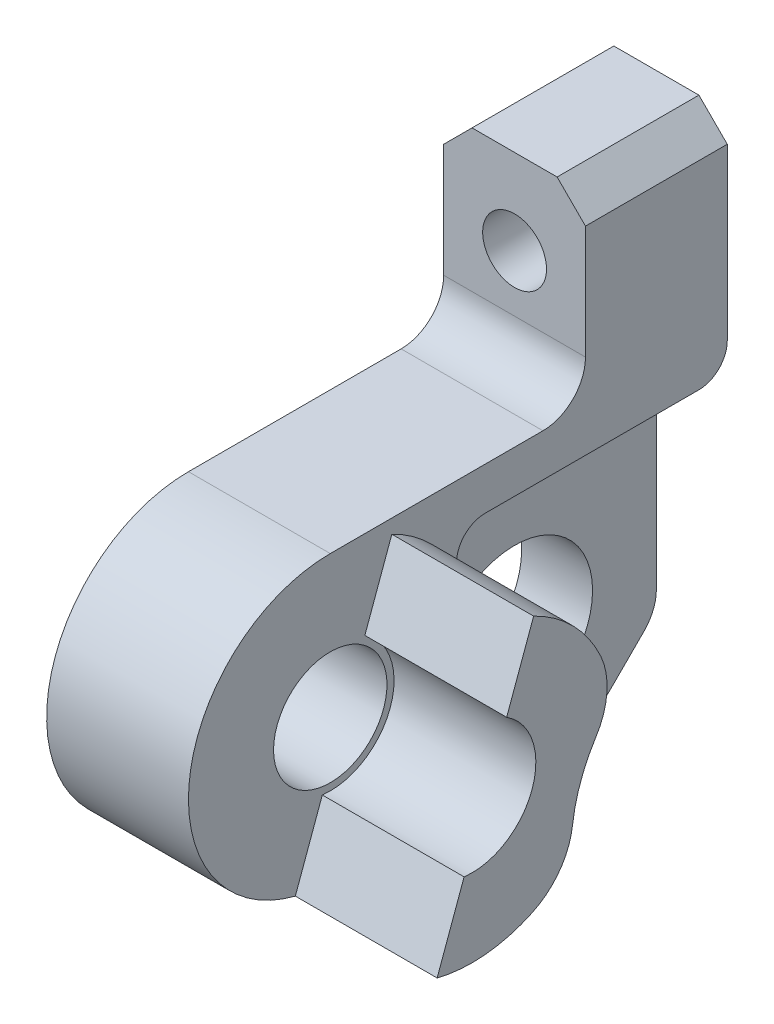
ISO-10303-21;
HEADER;
FILE_DESCRIPTION(('STEP AP214'),'2;1');
FILE_NAME('part.step','',(''),(''),'','','');
FILE_SCHEMA(('AUTOMOTIVE_DESIGN { 1 0 10303 214 1 1 1 1 }'));
ENDSEC;
DATA;
#1=APPLICATION_CONTEXT('core data for automotive mechanical design processes');
#2=APPLICATION_PROTOCOL_DEFINITION('international standard','automotive_design',2000,#1);
#3=PRODUCT_CONTEXT('',#1,'mechanical');
#4=PRODUCT('Part','Part','',(#3));
#5=PRODUCT_RELATED_PRODUCT_CATEGORY('part','',(#4));
#6=PRODUCT_DEFINITION_FORMATION('','',#4);
#7=PRODUCT_DEFINITION_CONTEXT('part definition',#1,'design');
#8=PRODUCT_DEFINITION('design','',#6,#7);
#9=PRODUCT_DEFINITION_SHAPE('','',#8);
#10=(LENGTH_UNIT() NAMED_UNIT(*) SI_UNIT(.MILLI.,.METRE.));
#11=(NAMED_UNIT(*) PLANE_ANGLE_UNIT() SI_UNIT($,.RADIAN.));
#12=(NAMED_UNIT(*) SI_UNIT($,.STERADIAN.) SOLID_ANGLE_UNIT());
#13=UNCERTAINTY_MEASURE_WITH_UNIT(LENGTH_MEASURE(1.E-05),#10,'distance_accuracy_value','');
#14=(GEOMETRIC_REPRESENTATION_CONTEXT(3) GLOBAL_UNCERTAINTY_ASSIGNED_CONTEXT((#13)) GLOBAL_UNIT_ASSIGNED_CONTEXT((#10,
#11,#12)) REPRESENTATION_CONTEXT('',''));
#15=CARTESIAN_POINT('',(0.,0.,0.));
#16=DIRECTION('',(0.,0.,1.));
#17=DIRECTION('',(1.,0.,0.));
#18=AXIS2_PLACEMENT_3D('',#15,#16,#17);
#19=CARTESIAN_POINT('',(7.5,0.,0.));
#20=DIRECTION('',(-1.,0.,0.));
#21=DIRECTION('',(0.,0.,1.));
#22=AXIS2_PLACEMENT_3D('',#19,#20,#21);
#23=PLANE('',#22);
#24=CARTESIAN_POINT('',(7.5,0.,0.));
#25=DIRECTION('',(-1.,0.,0.));
#26=DIRECTION('',(0.,0.,1.));
#27=AXIS2_PLACEMENT_3D('',#24,#25,#26);
#28=CIRCLE('',#27,4.);
#29=CARTESIAN_POINT('',(7.5,0.,4.));
#30=VERTEX_POINT('',#29);
#31=EDGE_CURVE('E348',#30,#30,#28,.T.);
#32=ORIENTED_EDGE('',*,*,#31,.T.);
#33=EDGE_LOOP('',(#32));
#34=FACE_BOUND('',#33,.T.);
#35=CARTESIAN_POINT('',(7.5,0.,0.));
#36=DIRECTION('',(1.,0.,0.));
#37=DIRECTION('',(0.,0.,-1.));
#38=AXIS2_PLACEMENT_3D('',#35,#36,#37);
#39=CIRCLE('',#38,10.);
#40=CARTESIAN_POINT('',(7.5,4.17319289451121,-9.0875993015318));
#41=VERTEX_POINT('',#40);
#42=CARTESIAN_POINT('',(7.5,9.00780338091209,-4.34275007925034));
#43=VERTEX_POINT('',#42);
#44=EDGE_CURVE('E255',#41,#43,#39,.T.);
#45=ORIENTED_EDGE('',*,*,#44,.F.);
#46=CARTESIAN_POINT('',(7.5,2.12739887121385,-4.52528335299855));
#47=DIRECTION('',(-1.,0.,0.));
#48=DIRECTION('',(0.,0.,1.));
#49=AXIS2_PLACEMENT_3D('',#46,#47,#48);
#50=CIRCLE('',#49,5.);
#51=CARTESIAN_POINT('',(7.5,4.17925682034681,-9.08487532559652));
#52=VERTEX_POINT('',#51);
#53=EDGE_CURVE('E278',#41,#52,#50,.F.);
#54=ORIENTED_EDGE('',*,*,#53,.T.);
#55=CARTESIAN_POINT('',(7.5,5.,-10.9087121146357));
#56=DIRECTION('',(1.,0.,0.));
#57=DIRECTION('',(0.,0.,-1.));
#58=AXIS2_PLACEMENT_3D('',#55,#56,#57);
#59=CIRCLE('',#58,2.);
#60=CARTESIAN_POINT('',(7.5,7.,-10.9087121146357));
#61=VERTEX_POINT('',#60);
#62=EDGE_CURVE('E380',#61,#52,#59,.T.);
#63=ORIENTED_EDGE('',*,*,#62,.F.);
#64=DIRECTION('',(0.,0.,1.));
#65=VECTOR('',#64,1.);
#66=CARTESIAN_POINT('',(7.5,7.,-26.));
#67=LINE('',#66,#65);
#68=CARTESIAN_POINT('',(7.5,7.,-26.));
#69=VERTEX_POINT('',#68);
#70=EDGE_CURVE('E552',#69,#61,#67,.T.);
#71=ORIENTED_EDGE('',*,*,#70,.F.);
#72=CARTESIAN_POINT('',(7.5,9.,-26.));
#73=DIRECTION('',(-1.,0.,0.));
#74=DIRECTION('',(0.,0.,1.));
#75=AXIS2_PLACEMENT_3D('',#72,#73,#74);
#76=CIRCLE('',#75,2.);
#77=CARTESIAN_POINT('',(7.5,9.,-28.));
#78=VERTEX_POINT('',#77);
#79=EDGE_CURVE('E549',#78,#69,#76,.T.);
#80=ORIENTED_EDGE('',*,*,#79,.F.);
#81=DIRECTION('',(0.,-1.,0.));
#82=VECTOR('',#81,1.);
#83=CARTESIAN_POINT('',(7.5,23.,-28.));
#84=LINE('',#83,#82);
#85=CARTESIAN_POINT('',(7.5,21.,-28.));
#86=VERTEX_POINT('',#85);
#87=EDGE_CURVE('E545',#86,#78,#84,.T.);
#88=ORIENTED_EDGE('',*,*,#87,.F.);
#89=DIRECTION('',(0.,0.,1.));
#90=VECTOR('',#89,1.);
#91=CARTESIAN_POINT('',(7.5,21.,0.));
#92=LINE('',#91,#90);
#93=CARTESIAN_POINT('',(7.5,21.,-18.));
#94=VERTEX_POINT('',#93);
#95=EDGE_CURVE('E418',#86,#94,#92,.T.);
#96=ORIENTED_EDGE('',*,*,#95,.T.);
#97=DIRECTION('',(0.,1.,0.));
#98=VECTOR('',#97,1.);
#99=CARTESIAN_POINT('',(7.5,13.,-18.));
#100=LINE('',#99,#98);
#101=CARTESIAN_POINT('',(7.5,13.,-18.));
#102=VERTEX_POINT('',#101);
#103=EDGE_CURVE('E544',#102,#94,#100,.T.);
#104=ORIENTED_EDGE('',*,*,#103,.F.);
#105=CARTESIAN_POINT('',(7.5,13.,-15.));
#106=DIRECTION('',(1.,0.,0.));
#107=DIRECTION('',(0.,0.,-1.));
#108=AXIS2_PLACEMENT_3D('',#105,#106,#107);
#109=CIRCLE('',#108,3.);
#110=CARTESIAN_POINT('',(7.5,10.,-15.));
#111=VERTEX_POINT('',#110);
#112=EDGE_CURVE('E541',#111,#102,#109,.T.);
#113=ORIENTED_EDGE('',*,*,#112,.F.);
#114=DIRECTION('',(0.,0.,-1.));
#115=VECTOR('',#114,1.);
#116=CARTESIAN_POINT('',(7.5,10.,0.));
#117=LINE('',#116,#115);
#118=CARTESIAN_POINT('',(7.5,10.,0.));
#119=VERTEX_POINT('',#118);
#120=EDGE_CURVE('E354',#119,#111,#117,.T.);
#121=ORIENTED_EDGE('',*,*,#120,.F.);
#122=CARTESIAN_POINT('',(7.5,0.,0.));
#123=DIRECTION('',(-1.,0.,0.));
#124=DIRECTION('',(0.,0.,1.));
#125=AXIS2_PLACEMENT_3D('',#122,#123,#124);
#126=CIRCLE('',#125,10.);
#127=CARTESIAN_POINT('',(7.5,-9.69184366756342,2.46336483767852));
#128=VERTEX_POINT('',#127);
#129=EDGE_CURVE('E356',#128,#119,#126,.T.);
#130=ORIENTED_EDGE('',*,*,#129,.F.);
#131=DIRECTION('',(0.,-0.93969262078591,0.342020143325666));
#132=VECTOR('',#131,1.);
#133=CARTESIAN_POINT('',(7.5,-0.342020143325666,-0.93969262078591));
#134=LINE('',#133,#132);
#135=CARTESIAN_POINT('',(7.5,-4.46490478457143,0.560914667940823));
#136=VERTEX_POINT('',#135);
#137=EDGE_CURVE('E272',#136,#128,#134,.T.);
#138=ORIENTED_EDGE('',*,*,#137,.F.);
#139=CARTESIAN_POINT('',(7.5,0.,0.));
#140=DIRECTION('',(1.,0.,0.));
#141=DIRECTION('',(0.,0.,-1.));
#142=AXIS2_PLACEMENT_3D('',#139,#140,#141);
#143=CIRCLE('',#142,4.5);
#144=CARTESIAN_POINT('',(7.5,3.7808644979201,-2.44029990951264));
#145=VERTEX_POINT('',#144);
#146=EDGE_CURVE('E56',#136,#145,#143,.T.);
#147=ORIENTED_EDGE('',*,*,#146,.T.);
#148=DIRECTION('',(0.,-0.93969262078591,0.342020143325665));
#149=VECTOR('',#148,1.);
#150=CARTESIAN_POINT('',(7.5,-0.342020143325665,-0.93969262078591));
#151=LINE('',#150,#149);
#152=EDGE_CURVE('E51',#43,#145,#151,.T.);
#153=ORIENTED_EDGE('',*,*,#152,.F.);
#154=EDGE_LOOP('',(#45,#54,#63,#71,#80,#88,#96,#104,#113,#121,#130,#138,#147,#153));
#155=FACE_BOUND('',#154,.T.);
#156=ADVANCED_FACE('F34',(#34,#155),#23,.F.);
#157=CARTESIAN_POINT('',(2.5,17.,-28.00005));
#158=DIRECTION('',(0.,0.,1.));
#159=DIRECTION('',(1.,0.,0.));
#160=AXIS2_PLACEMENT_3D('',#157,#158,#159);
#161=CYLINDRICAL_SURFACE('',#160,2.25);
#162=CARTESIAN_POINT('',(2.5,17.,-18.));
#163=DIRECTION('',(0.,0.,1.));
#164=DIRECTION('',(1.,0.,0.));
#165=AXIS2_PLACEMENT_3D('',#162,#163,#164);
#166=CIRCLE('',#165,2.25);
#167=CARTESIAN_POINT('',(4.75,17.,-18.));
#168=VERTEX_POINT('',#167);
#169=EDGE_CURVE('E345',#168,#168,#166,.T.);
#170=ORIENTED_EDGE('',*,*,#169,.T.);
#171=EDGE_LOOP('',(#170));
#172=FACE_BOUND('',#171,.T.);
#173=CARTESIAN_POINT('',(2.5,17.,-22.));
#174=DIRECTION('',(0.,0.,-1.));
#175=DIRECTION('',(-1.,0.,0.));
#176=AXIS2_PLACEMENT_3D('',#173,#174,#175);
#177=CIRCLE('',#176,2.25);
#178=CARTESIAN_POINT('',(0.250000000000001,17.,-22.));
#179=VERTEX_POINT('',#178);
#180=EDGE_CURVE('E334',#179,#179,#177,.F.);
#181=ORIENTED_EDGE('',*,*,#180,.F.);
#182=EDGE_LOOP('',(#181));
#183=FACE_BOUND('',#182,.T.);
#184=ADVANCED_FACE('F581',(#172,#183),#161,.F.);
#185=CARTESIAN_POINT('',(2.5,0.,0.));
#186=DIRECTION('',(1.,0.,0.));
#187=DIRECTION('',(0.,0.,-1.));
#188=AXIS2_PLACEMENT_3D('',#185,#186,#187);
#189=PLANE('',#188);
#190=CARTESIAN_POINT('',(2.5,-6.5,-18.));
#191=DIRECTION('',(1.,0.,0.));
#192=DIRECTION('',(0.,0.,-1.));
#193=AXIS2_PLACEMENT_3D('',#190,#191,#192);
#194=CIRCLE('',#193,5.5);
#195=CARTESIAN_POINT('',(2.5,-6.5,-23.5));
#196=VERTEX_POINT('',#195);
#197=EDGE_CURVE('E442',#196,#196,#194,.T.);
#198=ORIENTED_EDGE('',*,*,#197,.F.);
#199=EDGE_LOOP('',(#198));
#200=FACE_BOUND('',#199,.T.);
#201=CARTESIAN_POINT('',(2.5,5.,-10.9087121146357));
#202=DIRECTION('',(1.,0.,0.));
#203=DIRECTION('',(0.,0.,-1.));
#204=AXIS2_PLACEMENT_3D('',#201,#202,#203);
#205=CIRCLE('',#204,2.);
#206=CARTESIAN_POINT('',(2.5,7.,-10.9087121146357));
#207=VERTEX_POINT('',#206);
#208=CARTESIAN_POINT('',(2.5,4.17925682034681,-9.08487532559652));
#209=VERTEX_POINT('',#208);
#210=EDGE_CURVE('E433',#207,#209,#205,.T.);
#211=ORIENTED_EDGE('',*,*,#210,.T.);
#212=CARTESIAN_POINT('',(2.5,2.12739887121385,-4.52528335299855));
#213=DIRECTION('',(1.,0.,0.));
#214=DIRECTION('',(0.,0.,-1.));
#215=AXIS2_PLACEMENT_3D('',#212,#213,#214);
#216=CIRCLE('',#215,5.);
#217=CARTESIAN_POINT('',(2.5,-0.568663276040478,-8.7361323051865));
#218=VERTEX_POINT('',#217);
#219=EDGE_CURVE('E11',#209,#218,#216,.F.);
#220=ORIENTED_EDGE('',*,*,#219,.T.);
#221=CARTESIAN_POINT('',(2.5,-6.5,-18.));
#222=DIRECTION('',(1.,0.,0.));
#223=DIRECTION('',(0.,0.,1.));
#224=AXIS2_PLACEMENT_3D('',#221,#222,#223);
#225=CIRCLE('',#224,11.);
#226=CARTESIAN_POINT('',(2.5,-5.14379664903589,-7.08392412673704));
#227=VERTEX_POINT('',#226);
#228=EDGE_CURVE('E357',#218,#227,#225,.T.);
#229=ORIENTED_EDGE('',*,*,#228,.T.);
#230=CARTESIAN_POINT('',(2.5,-4.52734058041584,-2.12207145707206));
#231=DIRECTION('',(1.,0.,0.));
#232=DIRECTION('',(0.,0.,-1.));
#233=AXIS2_PLACEMENT_3D('',#230,#231,#232);
#234=CIRCLE('',#233,5.);
#235=CARTESIAN_POINT('',(2.5,-9.05468116083169,-4.24414291414412));
#236=VERTEX_POINT('',#235);
#237=EDGE_CURVE('E43',#227,#236,#234,.F.);
#238=ORIENTED_EDGE('',*,*,#237,.T.);
#239=CARTESIAN_POINT('',(2.5,0.,0.));
#240=DIRECTION('',(-1.,0.,0.));
#241=DIRECTION('',(0.,0.,1.));
#242=AXIS2_PLACEMENT_3D('',#239,#240,#241);
#243=CIRCLE('',#242,10.);
#244=CARTESIAN_POINT('',(2.5,-9.4910655687307,3.14955145537498));
#245=VERTEX_POINT('',#244);
#246=EDGE_CURVE('E351',#236,#245,#243,.T.);
#247=ORIENTED_EDGE('',*,*,#246,.T.);
#248=DIRECTION('',(0.,-0.314955145537498,-0.94910655687307));
#249=VECTOR('',#248,1.);
#250=CARTESIAN_POINT('',(2.5,-9.49106556873069,3.14955145537497));
#251=LINE('',#250,#249);
#252=CARTESIAN_POINT('',(2.5,-15.5165122902942,-15.0079261173938));
#253=VERTEX_POINT('',#252);
#254=EDGE_CURVE('E388',#245,#253,#251,.T.);
#255=ORIENTED_EDGE('',*,*,#254,.T.);
#256=CARTESIAN_POINT('',(2.5,-6.5,-18.));
#257=DIRECTION('',(1.,0.,0.));
#258=DIRECTION('',(0.,0.,-1.));
#259=AXIS2_PLACEMENT_3D('',#256,#257,#258);
#260=CIRCLE('',#259,9.5);
#261=CARTESIAN_POINT('',(2.5,-13.2175144212722,-24.7175144212722));
#262=VERTEX_POINT('',#261);
#263=EDGE_CURVE('E390',#253,#262,#260,.T.);
#264=ORIENTED_EDGE('',*,*,#263,.T.);
#265=DIRECTION('',(0.,0.707106781186545,-0.70710678118655));
#266=VECTOR('',#265,1.);
#267=CARTESIAN_POINT('',(2.5,-10.8137084989848,-27.1213203435596));
#268=LINE('',#267,#266);
#269=CARTESIAN_POINT('',(2.5,-10.8137084989848,-27.1213203435596));
#270=VERTEX_POINT('',#269);
#271=EDGE_CURVE('E452',#262,#270,#268,.T.);
#272=ORIENTED_EDGE('',*,*,#271,.T.);
#273=CARTESIAN_POINT('',(2.5,-8.69238815542512,-25.));
#274=DIRECTION('',(1.,0.,0.));
#275=DIRECTION('',(0.,0.,1.));
#276=AXIS2_PLACEMENT_3D('',#273,#274,#275);
#277=CIRCLE('',#276,3.);
#278=CARTESIAN_POINT('',(2.5,-8.69238815542512,-28.));
#279=VERTEX_POINT('',#278);
#280=EDGE_CURVE('E454',#270,#279,#277,.T.);
#281=ORIENTED_EDGE('',*,*,#280,.T.);
#282=DIRECTION('',(0.,1.,0.));
#283=VECTOR('',#282,1.);
#284=CARTESIAN_POINT('',(2.5,23.,-28.));
#285=LINE('',#284,#283);
#286=CARTESIAN_POINT('',(2.5,9.,-28.));
#287=VERTEX_POINT('',#286);
#288=EDGE_CURVE('E374',#279,#287,#285,.T.);
#289=ORIENTED_EDGE('',*,*,#288,.T.);
#290=CARTESIAN_POINT('',(2.5,9.,-26.));
#291=DIRECTION('',(-1.,0.,0.));
#292=DIRECTION('',(0.,0.,1.));
#293=AXIS2_PLACEMENT_3D('',#290,#291,#292);
#294=CIRCLE('',#293,2.);
#295=CARTESIAN_POINT('',(2.5,7.,-26.));
#296=VERTEX_POINT('',#295);
#297=EDGE_CURVE('E369',#287,#296,#294,.T.);
#298=ORIENTED_EDGE('',*,*,#297,.T.);
#299=DIRECTION('',(0.,0.,1.));
#300=VECTOR('',#299,1.);
#301=CARTESIAN_POINT('',(2.5,7.,-26.));
#302=LINE('',#301,#300);
#303=EDGE_CURVE('E385',#296,#207,#302,.T.);
#304=ORIENTED_EDGE('',*,*,#303,.T.);
#305=EDGE_LOOP('',(#211,#220,#229,#238,#247,#255,#264,#272,#281,#289,#298,#304));
#306=FACE_BOUND('',#305,.T.);
#307=ADVANCED_FACE('F431',(#200,#306),#189,.T.);
#308=CARTESIAN_POINT('',(-2.5,0.,0.));
#309=DIRECTION('',(1.,0.,0.));
#310=DIRECTION('',(0.,0.,-1.));
#311=AXIS2_PLACEMENT_3D('',#308,#309,#310);
#312=PLANE('',#311);
#313=CARTESIAN_POINT('',(-2.5,0.,0.));
#314=DIRECTION('',(1.,0.,0.));
#315=DIRECTION('',(0.,0.,-1.));
#316=AXIS2_PLACEMENT_3D('',#313,#314,#315);
#317=CIRCLE('',#316,4.);
#318=CARTESIAN_POINT('',(-2.5,0.,-4.));
#319=VERTEX_POINT('',#318);
#320=EDGE_CURVE('E445',#319,#319,#317,.T.);
#321=ORIENTED_EDGE('',*,*,#320,.T.);
#322=EDGE_LOOP('',(#321));
#323=FACE_BOUND('',#322,.T.);
#324=DIRECTION('',(0.,-1.,0.));
#325=VECTOR('',#324,1.);
#326=CARTESIAN_POINT('',(-2.5,23.,-18.));
#327=LINE('',#326,#325);
#328=CARTESIAN_POINT('',(-2.5,21.,-18.));
#329=VERTEX_POINT('',#328);
#330=CARTESIAN_POINT('',(-2.5,13.,-18.));
#331=VERTEX_POINT('',#330);
#332=EDGE_CURVE('E470',#329,#331,#327,.T.);
#333=ORIENTED_EDGE('',*,*,#332,.F.);
#334=DIRECTION('',(0.,0.,-1.));
#335=VECTOR('',#334,1.);
#336=CARTESIAN_POINT('',(-2.5,21.,0.));
#337=LINE('',#336,#335);
#338=CARTESIAN_POINT('',(-2.5,21.,-28.));
#339=VERTEX_POINT('',#338);
#340=EDGE_CURVE('E412',#329,#339,#337,.T.);
#341=ORIENTED_EDGE('',*,*,#340,.T.);
#342=DIRECTION('',(0.,1.,0.));
#343=VECTOR('',#342,1.);
#344=CARTESIAN_POINT('',(-2.5,23.,-28.));
#345=LINE('',#344,#343);
#346=CARTESIAN_POINT('',(-2.5,-8.69238815542512,-28.));
#347=VERTEX_POINT('',#346);
#348=EDGE_CURVE('E467',#347,#339,#345,.T.);
#349=ORIENTED_EDGE('',*,*,#348,.F.);
#350=CARTESIAN_POINT('',(-2.5,-8.69238815542512,-25.));
#351=DIRECTION('',(1.,0.,0.));
#352=DIRECTION('',(0.,0.,1.));
#353=AXIS2_PLACEMENT_3D('',#350,#351,#352);
#354=CIRCLE('',#353,3.);
#355=CARTESIAN_POINT('',(-2.5,-10.8137084989848,-27.1213203435596));
#356=VERTEX_POINT('',#355);
#357=EDGE_CURVE('E465',#356,#347,#354,.T.);
#358=ORIENTED_EDGE('',*,*,#357,.F.);
#359=DIRECTION('',(0.,0.707106781186545,-0.70710678118655));
#360=VECTOR('',#359,1.);
#361=CARTESIAN_POINT('',(-2.5,-10.8137084989848,-27.1213203435596));
#362=LINE('',#361,#360);
#363=CARTESIAN_POINT('',(-2.5,-13.2175144212722,-24.7175144212722));
#364=VERTEX_POINT('',#363);
#365=EDGE_CURVE('E463',#364,#356,#362,.T.);
#366=ORIENTED_EDGE('',*,*,#365,.F.);
#367=CARTESIAN_POINT('',(-2.5,-6.5,-18.));
#368=DIRECTION('',(1.,0.,0.));
#369=DIRECTION('',(0.,0.,-1.));
#370=AXIS2_PLACEMENT_3D('',#367,#368,#369);
#371=CIRCLE('',#370,9.5);
#372=CARTESIAN_POINT('',(-2.5,-15.5165122902942,-15.0079261173938));
#373=VERTEX_POINT('',#372);
#374=EDGE_CURVE('E461',#373,#364,#371,.T.);
#375=ORIENTED_EDGE('',*,*,#374,.F.);
#376=DIRECTION('',(0.,-0.314955145537498,-0.94910655687307));
#377=VECTOR('',#376,1.);
#378=CARTESIAN_POINT('',(-2.5,-9.49106556873069,3.14955145537497));
#379=LINE('',#378,#377);
#380=CARTESIAN_POINT('',(-2.5,-9.49106556873069,3.14955145537497));
#381=VERTEX_POINT('',#380);
#382=EDGE_CURVE('E459',#381,#373,#379,.T.);
#383=ORIENTED_EDGE('',*,*,#382,.F.);
#384=CARTESIAN_POINT('',(-2.5,0.,0.));
#385=DIRECTION('',(1.,0.,0.));
#386=DIRECTION('',(0.,0.,-1.));
#387=AXIS2_PLACEMENT_3D('',#384,#385,#386);
#388=CIRCLE('',#387,10.);
#389=CARTESIAN_POINT('',(-2.5,10.,0.));
#390=VERTEX_POINT('',#389);
#391=EDGE_CURVE('E450',#390,#381,#388,.T.);
#392=ORIENTED_EDGE('',*,*,#391,.F.);
#393=DIRECTION('',(0.,0.,1.));
#394=VECTOR('',#393,1.);
#395=CARTESIAN_POINT('',(-2.5,10.,0.));
#396=LINE('',#395,#394);
#397=CARTESIAN_POINT('',(-2.5,10.,-15.));
#398=VERTEX_POINT('',#397);
#399=EDGE_CURVE('E391',#398,#390,#396,.T.);
#400=ORIENTED_EDGE('',*,*,#399,.F.);
#401=CARTESIAN_POINT('',(-2.5,13.,-15.));
#402=DIRECTION('',(-1.,0.,0.));
#403=DIRECTION('',(0.,0.,-1.));
#404=AXIS2_PLACEMENT_3D('',#401,#402,#403);
#405=CIRCLE('',#404,3.);
#406=EDGE_CURVE('E472',#331,#398,#405,.T.);
#407=ORIENTED_EDGE('',*,*,#406,.F.);
#408=EDGE_LOOP('',(#333,#341,#349,#358,#366,#375,#383,#392,#400,#407));
#409=FACE_BOUND('',#408,.T.);
#410=CARTESIAN_POINT('',(-2.5,-6.5,-18.));
#411=DIRECTION('',(1.,0.,0.));
#412=DIRECTION('',(0.,0.,-1.));
#413=AXIS2_PLACEMENT_3D('',#410,#411,#412);
#414=CIRCLE('',#413,5.5);
#415=CARTESIAN_POINT('',(-2.5,-6.5,-23.5));
#416=VERTEX_POINT('',#415);
#417=EDGE_CURVE('E440',#416,#416,#414,.T.);
#418=ORIENTED_EDGE('',*,*,#417,.T.);
#419=EDGE_LOOP('',(#418));
#420=FACE_BOUND('',#419,.T.);
#421=ADVANCED_FACE('F510',(#323,#409,#420),#312,.F.);
#422=CARTESIAN_POINT('',(2.5,0.,0.));
#423=DIRECTION('',(-1.,0.,0.));
#424=DIRECTION('',(0.,0.,1.));
#425=AXIS2_PLACEMENT_3D('',#422,#423,#424);
#426=CYLINDRICAL_SURFACE('',#425,10.);
#427=ORIENTED_EDGE('',*,*,#246,.F.);
#428=DIRECTION('',(-1.,0.,0.));
#429=VECTOR('',#428,1.);
#430=CARTESIAN_POINT('',(2.5,-9.05468116083169,-4.24414291414412));
#431=LINE('',#430,#429);
#432=CARTESIAN_POINT('',(17.5,-9.05468116083168,-4.24414291414412));
#433=VERTEX_POINT('',#432);
#434=EDGE_CURVE('E364',#236,#433,#431,.F.);
#435=ORIENTED_EDGE('',*,*,#434,.T.);
#436=CARTESIAN_POINT('',(17.5,0.,0.));
#437=DIRECTION('',(1.,0.,0.));
#438=DIRECTION('',(0.,0.,-1.));
#439=AXIS2_PLACEMENT_3D('',#436,#437,#438);
#440=CIRCLE('',#439,10.);
#441=CARTESIAN_POINT('',(17.5,-9.69184366756342,2.46336483767852));
#442=VERTEX_POINT('',#441);
#443=EDGE_CURVE('E248',#442,#433,#440,.T.);
#444=ORIENTED_EDGE('',*,*,#443,.F.);
#445=DIRECTION('',(-1.,0.,0.));
#446=VECTOR('',#445,1.);
#447=CARTESIAN_POINT('',(17.5,-9.69184366756342,2.46336483767852));
#448=LINE('',#447,#446);
#449=EDGE_CURVE('E239',#442,#128,#448,.T.);
#450=ORIENTED_EDGE('',*,*,#449,.T.);
#451=ORIENTED_EDGE('',*,*,#129,.T.);
#452=DIRECTION('',(-1.,0.,0.));
#453=VECTOR('',#452,1.);
#454=CARTESIAN_POINT('',(2.5,10.,0.));
#455=LINE('',#454,#453);
#456=EDGE_CURVE('E475',#119,#390,#455,.T.);
#457=ORIENTED_EDGE('',*,*,#456,.T.);
#458=ORIENTED_EDGE('',*,*,#391,.T.);
#459=DIRECTION('',(-1.,0.,0.));
#460=VECTOR('',#459,1.);
#461=CARTESIAN_POINT('',(2.5,-9.49106556873069,3.14955145537497));
#462=LINE('',#461,#460);
#463=EDGE_CURVE('E394',#245,#381,#462,.T.);
#464=ORIENTED_EDGE('',*,*,#463,.F.);
#465=EDGE_LOOP('',(#427,#435,#444,#450,#451,#457,#458,#464));
#466=FACE_BOUND('',#465,.T.);
#467=ADVANCED_FACE('F528',(#466),#426,.T.);
#468=CARTESIAN_POINT('',(2.5,-9.49106556873069,3.14955145537497));
#469=DIRECTION('',(0.,0.94910655687307,-0.314955145537498));
#470=DIRECTION('',(0.,0.314955145537498,0.94910655687307));
#471=AXIS2_PLACEMENT_3D('',#468,#469,#470);
#472=PLANE('',#471);
#473=ORIENTED_EDGE('',*,*,#382,.T.);
#474=DIRECTION('',(-1.,0.,0.));
#475=VECTOR('',#474,1.);
#476=CARTESIAN_POINT('',(2.5,-15.5165122902942,-15.0079261173938));
#477=LINE('',#476,#475);
#478=EDGE_CURVE('E398',#253,#373,#477,.T.);
#479=ORIENTED_EDGE('',*,*,#478,.F.);
#480=ORIENTED_EDGE('',*,*,#254,.F.);
#481=ORIENTED_EDGE('',*,*,#463,.T.);
#482=EDGE_LOOP('',(#473,#479,#480,#481));
#483=FACE_BOUND('',#482,.T.);
#484=ADVANCED_FACE('F526',(#483),#472,.F.);
#485=CARTESIAN_POINT('',(2.5,-6.5,-18.));
#486=DIRECTION('',(-1.,0.,0.));
#487=DIRECTION('',(0.,0.,1.));
#488=AXIS2_PLACEMENT_3D('',#485,#486,#487);
#489=CYLINDRICAL_SURFACE('',#488,9.5);
#490=ORIENTED_EDGE('',*,*,#374,.T.);
#491=DIRECTION('',(-1.,0.,0.));
#492=VECTOR('',#491,1.);
#493=CARTESIAN_POINT('',(2.5,-13.2175144212722,-24.7175144212722));
#494=LINE('',#493,#492);
#495=EDGE_CURVE('E496',#262,#364,#494,.T.);
#496=ORIENTED_EDGE('',*,*,#495,.F.);
#497=ORIENTED_EDGE('',*,*,#263,.F.);
#498=ORIENTED_EDGE('',*,*,#478,.T.);
#499=EDGE_LOOP('',(#490,#496,#497,#498));
#500=FACE_BOUND('',#499,.T.);
#501=ADVANCED_FACE('F503',(#500),#489,.T.);
#502=CARTESIAN_POINT('',(2.5,-10.8137084989848,-27.1213203435596));
#503=DIRECTION('',(0.,0.70710678118655,0.707106781186545));
#504=DIRECTION('',(0.,-0.707106781186545,0.70710678118655));
#505=AXIS2_PLACEMENT_3D('',#502,#503,#504);
#506=PLANE('',#505);
#507=ORIENTED_EDGE('',*,*,#365,.T.);
#508=DIRECTION('',(-1.,0.,0.));
#509=VECTOR('',#508,1.);
#510=CARTESIAN_POINT('',(2.5,-10.8137084989848,-27.1213203435596));
#511=LINE('',#510,#509);
#512=EDGE_CURVE('E493',#270,#356,#511,.T.);
#513=ORIENTED_EDGE('',*,*,#512,.F.);
#514=ORIENTED_EDGE('',*,*,#271,.F.);
#515=ORIENTED_EDGE('',*,*,#495,.T.);
#516=EDGE_LOOP('',(#507,#513,#514,#515));
#517=FACE_BOUND('',#516,.T.);
#518=ADVANCED_FACE('F517',(#517),#506,.F.);
#519=CARTESIAN_POINT('',(2.5,-8.69238815542512,-25.));
#520=DIRECTION('',(-1.,0.,0.));
#521=DIRECTION('',(0.,0.,1.));
#522=AXIS2_PLACEMENT_3D('',#519,#520,#521);
#523=CYLINDRICAL_SURFACE('',#522,3.);
#524=ORIENTED_EDGE('',*,*,#357,.T.);
#525=DIRECTION('',(-1.,0.,0.));
#526=VECTOR('',#525,1.);
#527=CARTESIAN_POINT('',(2.5,-8.69238815542512,-28.));
#528=LINE('',#527,#526);
#529=EDGE_CURVE('E490',#279,#347,#528,.T.);
#530=ORIENTED_EDGE('',*,*,#529,.F.);
#531=ORIENTED_EDGE('',*,*,#280,.F.);
#532=ORIENTED_EDGE('',*,*,#512,.T.);
#533=EDGE_LOOP('',(#524,#530,#531,#532));
#534=FACE_BOUND('',#533,.T.);
#535=ADVANCED_FACE('F521',(#534),#523,.T.);
#536=CARTESIAN_POINT('',(2.5,23.,-28.));
#537=DIRECTION('',(0.,0.,1.));
#538=DIRECTION('',(1.,0.,0.));
#539=AXIS2_PLACEMENT_3D('',#536,#537,#538);
#540=PLANE('',#539);
#541=DIRECTION('',(-0.866025403784438,-0.5,0.));
#542=VECTOR('',#541,1.);
#543=CARTESIAN_POINT('',(6.05,14.9504065443768,-28.));
#544=LINE('',#543,#542);
#545=CARTESIAN_POINT('',(6.05,14.9504065443768,-28.));
#546=VERTEX_POINT('',#545);
#547=CARTESIAN_POINT('',(2.5,12.9008130887537,-28.));
#548=VERTEX_POINT('',#547);
#549=EDGE_CURVE('E318',#546,#548,#544,.T.);
#550=ORIENTED_EDGE('',*,*,#549,.F.);
#551=DIRECTION('',(0.,-1.,0.));
#552=VECTOR('',#551,1.);
#553=CARTESIAN_POINT('',(6.05,19.0495934556232,-28.));
#554=LINE('',#553,#552);
#555=CARTESIAN_POINT('',(6.05,19.0495934556232,-28.));
#556=VERTEX_POINT('',#555);
#557=EDGE_CURVE('E238',#556,#546,#554,.T.);
#558=ORIENTED_EDGE('',*,*,#557,.F.);
#559=DIRECTION('',(0.86602540378444,-0.499999999999999,0.));
#560=VECTOR('',#559,1.);
#561=CARTESIAN_POINT('',(2.5,21.0991869112463,-28.));
#562=LINE('',#561,#560);
#563=CARTESIAN_POINT('',(2.5,21.0991869112463,-28.));
#564=VERTEX_POINT('',#563);
#565=EDGE_CURVE('E301',#564,#556,#562,.T.);
#566=ORIENTED_EDGE('',*,*,#565,.F.);
#567=DIRECTION('',(0.866025403784438,0.5,0.));
#568=VECTOR('',#567,1.);
#569=CARTESIAN_POINT('',(-1.05,19.0495934556232,-28.));
#570=LINE('',#569,#568);
#571=CARTESIAN_POINT('',(-1.05,19.0495934556232,-28.));
#572=VERTEX_POINT('',#571);
#573=EDGE_CURVE('E327',#572,#564,#570,.T.);
#574=ORIENTED_EDGE('',*,*,#573,.F.);
#575=DIRECTION('',(0.,1.,0.));
#576=VECTOR('',#575,1.);
#577=CARTESIAN_POINT('',(-1.05,14.9504065443768,-28.));
#578=LINE('',#577,#576);
#579=CARTESIAN_POINT('',(-1.05,14.9504065443768,-28.));
#580=VERTEX_POINT('',#579);
#581=EDGE_CURVE('E324',#580,#572,#578,.T.);
#582=ORIENTED_EDGE('',*,*,#581,.F.);
#583=DIRECTION('',(-0.866025403784439,0.499999999999999,0.));
#584=VECTOR('',#583,1.);
#585=CARTESIAN_POINT('',(2.5,12.9008130887537,-28.));
#586=LINE('',#585,#584);
#587=EDGE_CURVE('E321',#548,#580,#586,.T.);
#588=ORIENTED_EDGE('',*,*,#587,.F.);
#589=EDGE_LOOP('',(#550,#558,#566,#574,#582,#588));
#590=FACE_BOUND('',#589,.T.);
#591=ORIENTED_EDGE('',*,*,#348,.T.);
#592=DIRECTION('',(-0.707106781186545,-0.70710678118655,0.));
#593=VECTOR('',#592,1.);
#594=CARTESIAN_POINT('',(-0.500000000000005,23.,-28.));
#595=LINE('',#594,#593);
#596=CARTESIAN_POINT('',(-0.500000000000005,23.,-28.));
#597=VERTEX_POINT('',#596);
#598=EDGE_CURVE('E416',#339,#597,#595,.F.);
#599=ORIENTED_EDGE('',*,*,#598,.T.);
#600=DIRECTION('',(-1.,0.,0.));
#601=VECTOR('',#600,1.);
#602=CARTESIAN_POINT('',(2.5,23.,-28.));
#603=LINE('',#602,#601);
#604=CARTESIAN_POINT('',(5.5,23.,-28.));
#605=VERTEX_POINT('',#604);
#606=EDGE_CURVE('E487',#605,#597,#603,.T.);
#607=ORIENTED_EDGE('',*,*,#606,.F.);
#608=DIRECTION('',(-0.707106781186545,0.70710678118655,0.));
#609=VECTOR('',#608,1.);
#610=CARTESIAN_POINT('',(5.50000000000001,23.,-28.));
#611=LINE('',#610,#609);
#612=EDGE_CURVE('E414',#605,#86,#611,.F.);
#613=ORIENTED_EDGE('',*,*,#612,.T.);
#614=ORIENTED_EDGE('',*,*,#87,.T.);
#615=DIRECTION('',(-1.,0.,0.));
#616=VECTOR('',#615,1.);
#617=CARTESIAN_POINT('',(7.5,9.,-28.));
#618=LINE('',#617,#616);
#619=EDGE_CURVE('E377',#78,#287,#618,.T.);
#620=ORIENTED_EDGE('',*,*,#619,.T.);
#621=ORIENTED_EDGE('',*,*,#288,.F.);
#622=ORIENTED_EDGE('',*,*,#529,.T.);
#623=EDGE_LOOP('',(#591,#599,#607,#613,#614,#620,#621,#622));
#624=FACE_BOUND('',#623,.T.);
#625=ADVANCED_FACE('F627',(#590,#624),#540,.F.);
#626=CARTESIAN_POINT('',(2.5,23.,-28.));
#627=DIRECTION('',(0.,-1.,0.));
#628=DIRECTION('',(0.,0.,-1.));
#629=AXIS2_PLACEMENT_3D('',#626,#627,#628);
#630=PLANE('',#629);
#631=ORIENTED_EDGE('',*,*,#606,.T.);
#632=DIRECTION('',(0.,0.,1.));
#633=VECTOR('',#632,1.);
#634=CARTESIAN_POINT('',(-0.500000000000005,23.,-28.));
#635=LINE('',#634,#633);
#636=CARTESIAN_POINT('',(-0.500000000000005,23.,-18.));
#637=VERTEX_POINT('',#636);
#638=EDGE_CURVE('E405',#597,#637,#635,.T.);
#639=ORIENTED_EDGE('',*,*,#638,.T.);
#640=DIRECTION('',(-1.,0.,0.));
#641=VECTOR('',#640,1.);
#642=CARTESIAN_POINT('',(2.5,23.,-18.));
#643=LINE('',#642,#641);
#644=CARTESIAN_POINT('',(5.5,23.,-18.));
#645=VERTEX_POINT('',#644);
#646=EDGE_CURVE('E484',#645,#637,#643,.T.);
#647=ORIENTED_EDGE('',*,*,#646,.F.);
#648=DIRECTION('',(0.,0.,-1.));
#649=VECTOR('',#648,1.);
#650=CARTESIAN_POINT('',(5.50000000000001,23.,-28.));
#651=LINE('',#650,#649);
#652=EDGE_CURVE('E397',#645,#605,#651,.T.);
#653=ORIENTED_EDGE('',*,*,#652,.T.);
#654=EDGE_LOOP('',(#631,#639,#647,#653));
#655=FACE_BOUND('',#654,.T.);
#656=ADVANCED_FACE('F623',(#655),#630,.F.);
#657=CARTESIAN_POINT('',(2.5,23.,-18.));
#658=DIRECTION('',(0.,0.,-1.));
#659=DIRECTION('',(-1.,0.,0.));
#660=AXIS2_PLACEMENT_3D('',#657,#658,#659);
#661=PLANE('',#660);
#662=ORIENTED_EDGE('',*,*,#169,.F.);
#663=EDGE_LOOP('',(#662));
#664=FACE_BOUND('',#663,.T.);
#665=ORIENTED_EDGE('',*,*,#646,.T.);
#666=DIRECTION('',(0.707106781186545,0.70710678118655,0.));
#667=VECTOR('',#666,1.);
#668=CARTESIAN_POINT('',(-0.500000000000005,23.,-18.));
#669=LINE('',#668,#667);
#670=EDGE_CURVE('E410',#637,#329,#669,.F.);
#671=ORIENTED_EDGE('',*,*,#670,.T.);
#672=ORIENTED_EDGE('',*,*,#332,.T.);
#673=DIRECTION('',(-1.,0.,0.));
#674=VECTOR('',#673,1.);
#675=CARTESIAN_POINT('',(2.5,13.,-18.));
#676=LINE('',#675,#674);
#677=EDGE_CURVE('E481',#102,#331,#676,.T.);
#678=ORIENTED_EDGE('',*,*,#677,.F.);
#679=ORIENTED_EDGE('',*,*,#103,.T.);
#680=DIRECTION('',(0.707106781186545,-0.70710678118655,0.));
#681=VECTOR('',#680,1.);
#682=CARTESIAN_POINT('',(5.50000000000001,23.,-18.));
#683=LINE('',#682,#681);
#684=EDGE_CURVE('E408',#94,#645,#683,.F.);
#685=ORIENTED_EDGE('',*,*,#684,.T.);
#686=EDGE_LOOP('',(#665,#671,#672,#678,#679,#685));
#687=FACE_BOUND('',#686,.T.);
#688=ADVANCED_FACE('F620',(#664,#687),#661,.F.);
#689=CARTESIAN_POINT('',(2.5,13.,-15.));
#690=DIRECTION('',(-1.,0.,0.));
#691=DIRECTION('',(0.,0.,1.));
#692=AXIS2_PLACEMENT_3D('',#689,#690,#691);
#693=CYLINDRICAL_SURFACE('',#692,3.);
#694=ORIENTED_EDGE('',*,*,#406,.T.);
#695=DIRECTION('',(-1.,0.,0.));
#696=VECTOR('',#695,1.);
#697=CARTESIAN_POINT('',(2.5,10.,-15.));
#698=LINE('',#697,#696);
#699=EDGE_CURVE('E478',#111,#398,#698,.T.);
#700=ORIENTED_EDGE('',*,*,#699,.F.);
#701=ORIENTED_EDGE('',*,*,#112,.T.);
#702=ORIENTED_EDGE('',*,*,#677,.T.);
#703=EDGE_LOOP('',(#694,#700,#701,#702));
#704=FACE_BOUND('',#703,.T.);
#705=ADVANCED_FACE('F540',(#704),#693,.F.);
#706=CARTESIAN_POINT('',(2.5,10.,0.));
#707=DIRECTION('',(0.,-1.,0.));
#708=DIRECTION('',(0.,0.,-1.));
#709=AXIS2_PLACEMENT_3D('',#706,#707,#708);
#710=PLANE('',#709);
#711=ORIENTED_EDGE('',*,*,#399,.T.);
#712=ORIENTED_EDGE('',*,*,#456,.F.);
#713=ORIENTED_EDGE('',*,*,#120,.T.);
#714=ORIENTED_EDGE('',*,*,#699,.T.);
#715=EDGE_LOOP('',(#711,#712,#713,#714));
#716=FACE_BOUND('',#715,.T.);
#717=ADVANCED_FACE('F534',(#716),#710,.F.);
#718=CARTESIAN_POINT('',(2.5,0.,0.));
#719=DIRECTION('',(-1.,0.,0.));
#720=DIRECTION('',(0.,0.,1.));
#721=AXIS2_PLACEMENT_3D('',#718,#719,#720);
#722=CYLINDRICAL_SURFACE('',#721,4.);
#723=ORIENTED_EDGE('',*,*,#320,.F.);
#724=EDGE_LOOP('',(#723));
#725=FACE_BOUND('',#724,.T.);
#726=ORIENTED_EDGE('',*,*,#31,.F.);
#727=EDGE_LOOP('',(#726));
#728=FACE_BOUND('',#727,.T.);
#729=ADVANCED_FACE('F605',(#725,#728),#722,.F.);
#730=CARTESIAN_POINT('',(2.5,-6.5,-18.));
#731=DIRECTION('',(-1.,0.,0.));
#732=DIRECTION('',(0.,0.,1.));
#733=AXIS2_PLACEMENT_3D('',#730,#731,#732);
#734=CYLINDRICAL_SURFACE('',#733,5.5);
#735=ORIENTED_EDGE('',*,*,#197,.T.);
#736=EDGE_LOOP('',(#735));
#737=FACE_BOUND('',#736,.T.);
#738=ORIENTED_EDGE('',*,*,#417,.F.);
#739=EDGE_LOOP('',(#738));
#740=FACE_BOUND('',#739,.T.);
#741=ADVANCED_FACE('F593',(#737,#740),#734,.F.);
#742=CARTESIAN_POINT('',(7.5,-6.5,-18.));
#743=DIRECTION('',(-1.,0.,0.));
#744=DIRECTION('',(0.,0.,1.));
#745=AXIS2_PLACEMENT_3D('',#742,#743,#744);
#746=CYLINDRICAL_SURFACE('',#745,11.);
#747=DIRECTION('',(-1.,0.,0.));
#748=VECTOR('',#747,1.);
#749=CARTESIAN_POINT('',(7.5,-0.568663276040478,-8.7361323051865));
#750=LINE('',#749,#748);
#751=CARTESIAN_POINT('',(17.5,-0.568663276040479,-8.7361323051865));
#752=VERTEX_POINT('',#751);
#753=EDGE_CURVE('E419',#218,#752,#750,.F.);
#754=ORIENTED_EDGE('',*,*,#753,.T.);
#755=CARTESIAN_POINT('',(17.5,-6.5,-18.));
#756=DIRECTION('',(1.,0.,0.));
#757=DIRECTION('',(0.,0.,-1.));
#758=AXIS2_PLACEMENT_3D('',#755,#756,#757);
#759=CIRCLE('',#758,11.);
#760=CARTESIAN_POINT('',(17.5,-5.14379664903589,-7.08392412673704));
#761=VERTEX_POINT('',#760);
#762=EDGE_CURVE('E262',#761,#752,#759,.F.);
#763=ORIENTED_EDGE('',*,*,#762,.F.);
#764=DIRECTION('',(-1.,0.,0.));
#765=VECTOR('',#764,1.);
#766=CARTESIAN_POINT('',(7.5,-5.14379664903589,-7.08392412673704));
#767=LINE('',#766,#765);
#768=EDGE_CURVE('E366',#761,#227,#767,.T.);
#769=ORIENTED_EDGE('',*,*,#768,.T.);
#770=ORIENTED_EDGE('',*,*,#228,.F.);
#771=EDGE_LOOP('',(#754,#763,#769,#770));
#772=FACE_BOUND('',#771,.T.);
#773=ADVANCED_FACE('F426',(#772),#746,.F.);
#774=CARTESIAN_POINT('',(7.5,5.,-10.9087121146357));
#775=DIRECTION('',(-1.,0.,0.));
#776=DIRECTION('',(0.,0.,1.));
#777=AXIS2_PLACEMENT_3D('',#774,#775,#776);
#778=CYLINDRICAL_SURFACE('',#777,2.);
#779=ORIENTED_EDGE('',*,*,#62,.T.);
#780=DIRECTION('',(-1.,0.,0.));
#781=VECTOR('',#780,1.);
#782=CARTESIAN_POINT('',(7.5,4.17925682034681,-9.08487532559652));
#783=LINE('',#782,#781);
#784=EDGE_CURVE('E360',#52,#209,#783,.T.);
#785=ORIENTED_EDGE('',*,*,#784,.T.);
#786=ORIENTED_EDGE('',*,*,#210,.F.);
#787=DIRECTION('',(-1.,0.,0.));
#788=VECTOR('',#787,1.);
#789=CARTESIAN_POINT('',(7.5,7.,-10.9087121146357));
#790=LINE('',#789,#788);
#791=EDGE_CURVE('E438',#61,#207,#790,.T.);
#792=ORIENTED_EDGE('',*,*,#791,.F.);
#793=EDGE_LOOP('',(#779,#785,#786,#792));
#794=FACE_BOUND('',#793,.T.);
#795=ADVANCED_FACE('F565',(#794),#778,.F.);
#796=CARTESIAN_POINT('',(7.5,7.,-26.));
#797=DIRECTION('',(0.,-1.,0.));
#798=DIRECTION('',(0.,0.,-1.));
#799=AXIS2_PLACEMENT_3D('',#796,#797,#798);
#800=PLANE('',#799);
#801=ORIENTED_EDGE('',*,*,#303,.F.);
#802=DIRECTION('',(-1.,0.,0.));
#803=VECTOR('',#802,1.);
#804=CARTESIAN_POINT('',(7.5,7.,-26.));
#805=LINE('',#804,#803);
#806=EDGE_CURVE('E379',#69,#296,#805,.T.);
#807=ORIENTED_EDGE('',*,*,#806,.F.);
#808=ORIENTED_EDGE('',*,*,#70,.T.);
#809=ORIENTED_EDGE('',*,*,#791,.T.);
#810=EDGE_LOOP('',(#801,#807,#808,#809));
#811=FACE_BOUND('',#810,.T.);
#812=ADVANCED_FACE('F561',(#811),#800,.T.);
#813=CARTESIAN_POINT('',(7.5,9.,-26.));
#814=DIRECTION('',(-1.,0.,0.));
#815=DIRECTION('',(0.,0.,1.));
#816=AXIS2_PLACEMENT_3D('',#813,#814,#815);
#817=CYLINDRICAL_SURFACE('',#816,2.);
#818=ORIENTED_EDGE('',*,*,#297,.F.);
#819=ORIENTED_EDGE('',*,*,#619,.F.);
#820=ORIENTED_EDGE('',*,*,#79,.T.);
#821=ORIENTED_EDGE('',*,*,#806,.T.);
#822=EDGE_LOOP('',(#818,#819,#820,#821));
#823=FACE_BOUND('',#822,.T.);
#824=ADVANCED_FACE('F598',(#823),#817,.T.);
#825=CARTESIAN_POINT('',(0.,0.,-22.));
#826=DIRECTION('',(0.,0.,-1.));
#827=DIRECTION('',(-1.,0.,0.));
#828=AXIS2_PLACEMENT_3D('',#825,#826,#827);
#829=PLANE('',#828);
#830=DIRECTION('',(0.,-1.,0.));
#831=VECTOR('',#830,1.);
#832=CARTESIAN_POINT('',(6.05,19.0495934556232,-22.));
#833=LINE('',#832,#831);
#834=CARTESIAN_POINT('',(6.05,19.0495934556232,-22.));
#835=VERTEX_POINT('',#834);
#836=CARTESIAN_POINT('',(6.05,14.9504065443768,-22.));
#837=VERTEX_POINT('',#836);
#838=EDGE_CURVE('E297',#835,#837,#833,.T.);
#839=ORIENTED_EDGE('',*,*,#838,.T.);
#840=DIRECTION('',(-0.866025403784438,-0.5,0.));
#841=VECTOR('',#840,1.);
#842=CARTESIAN_POINT('',(6.05,14.9504065443768,-22.));
#843=LINE('',#842,#841);
#844=CARTESIAN_POINT('',(2.5,12.9008130887537,-22.));
#845=VERTEX_POINT('',#844);
#846=EDGE_CURVE('E300',#837,#845,#843,.T.);
#847=ORIENTED_EDGE('',*,*,#846,.T.);
#848=DIRECTION('',(-0.866025403784439,0.499999999999999,0.));
#849=VECTOR('',#848,1.);
#850=CARTESIAN_POINT('',(2.5,12.9008130887537,-22.));
#851=LINE('',#850,#849);
#852=CARTESIAN_POINT('',(-1.05,14.9504065443768,-22.));
#853=VERTEX_POINT('',#852);
#854=EDGE_CURVE('E304',#845,#853,#851,.T.);
#855=ORIENTED_EDGE('',*,*,#854,.T.);
#856=DIRECTION('',(0.,1.,0.));
#857=VECTOR('',#856,1.);
#858=CARTESIAN_POINT('',(-1.05,14.9504065443768,-22.));
#859=LINE('',#858,#857);
#860=CARTESIAN_POINT('',(-1.05,19.0495934556232,-22.));
#861=VERTEX_POINT('',#860);
#862=EDGE_CURVE('E307',#853,#861,#859,.T.);
#863=ORIENTED_EDGE('',*,*,#862,.T.);
#864=DIRECTION('',(0.866025403784438,0.5,0.));
#865=VECTOR('',#864,1.);
#866=CARTESIAN_POINT('',(-1.05,19.0495934556232,-22.));
#867=LINE('',#866,#865);
#868=CARTESIAN_POINT('',(2.5,21.0991869112463,-22.));
#869=VERTEX_POINT('',#868);
#870=EDGE_CURVE('E310',#861,#869,#867,.T.);
#871=ORIENTED_EDGE('',*,*,#870,.T.);
#872=DIRECTION('',(0.86602540378444,-0.499999999999999,0.));
#873=VECTOR('',#872,1.);
#874=CARTESIAN_POINT('',(2.5,21.0991869112463,-22.));
#875=LINE('',#874,#873);
#876=EDGE_CURVE('E313',#869,#835,#875,.T.);
#877=ORIENTED_EDGE('',*,*,#876,.T.);
#878=EDGE_LOOP('',(#839,#847,#855,#863,#871,#877));
#879=FACE_BOUND('',#878,.T.);
#880=ORIENTED_EDGE('',*,*,#180,.T.);
#881=EDGE_LOOP('',(#880));
#882=FACE_BOUND('',#881,.T.);
#883=ADVANCED_FACE('F601',(#879,#882),#829,.T.);
#884=CARTESIAN_POINT('',(6.05,19.0495934556232,-22.));
#885=DIRECTION('',(1.,0.,0.));
#886=DIRECTION('',(0.,0.,-1.));
#887=AXIS2_PLACEMENT_3D('',#884,#885,#886);
#888=PLANE('',#887);
#889=ORIENTED_EDGE('',*,*,#557,.T.);
#890=DIRECTION('',(0.,0.,-1.));
#891=VECTOR('',#890,1.);
#892=CARTESIAN_POINT('',(6.05,14.9504065443768,-22.));
#893=LINE('',#892,#891);
#894=EDGE_CURVE('E316',#837,#546,#893,.T.);
#895=ORIENTED_EDGE('',*,*,#894,.F.);
#896=ORIENTED_EDGE('',*,*,#838,.F.);
#897=DIRECTION('',(0.,0.,-1.));
#898=VECTOR('',#897,1.);
#899=CARTESIAN_POINT('',(6.05,19.0495934556232,-22.));
#900=LINE('',#899,#898);
#901=EDGE_CURVE('E332',#835,#556,#900,.T.);
#902=ORIENTED_EDGE('',*,*,#901,.T.);
#903=EDGE_LOOP('',(#889,#895,#896,#902));
#904=FACE_BOUND('',#903,.T.);
#905=ADVANCED_FACE('F681',(#904),#888,.F.);
#906=CARTESIAN_POINT('',(2.5,21.0991869112463,-22.));
#907=DIRECTION('',(0.499999999999998,0.866025403784439,0.));
#908=DIRECTION('',(-0.86602540378444,0.499999999999999,0.));
#909=AXIS2_PLACEMENT_3D('',#906,#907,#908);
#910=PLANE('',#909);
#911=ORIENTED_EDGE('',*,*,#565,.T.);
#912=ORIENTED_EDGE('',*,*,#901,.F.);
#913=ORIENTED_EDGE('',*,*,#876,.F.);
#914=DIRECTION('',(0.,0.,-1.));
#915=VECTOR('',#914,1.);
#916=CARTESIAN_POINT('',(2.5,21.0991869112463,-22.));
#917=LINE('',#916,#915);
#918=EDGE_CURVE('E335',#869,#564,#917,.T.);
#919=ORIENTED_EDGE('',*,*,#918,.T.);
#920=EDGE_LOOP('',(#911,#912,#913,#919));
#921=FACE_BOUND('',#920,.T.);
#922=ADVANCED_FACE('F683',(#921),#910,.F.);
#923=CARTESIAN_POINT('',(-1.05,19.0495934556232,-22.));
#924=DIRECTION('',(-0.5,0.866025403784438,0.));
#925=DIRECTION('',(-0.866025403784438,-0.5,0.));
#926=AXIS2_PLACEMENT_3D('',#923,#924,#925);
#927=PLANE('',#926);
#928=ORIENTED_EDGE('',*,*,#573,.T.);
#929=ORIENTED_EDGE('',*,*,#918,.F.);
#930=ORIENTED_EDGE('',*,*,#870,.F.);
#931=DIRECTION('',(0.,0.,-1.));
#932=VECTOR('',#931,1.);
#933=CARTESIAN_POINT('',(-1.05,19.0495934556232,-22.));
#934=LINE('',#933,#932);
#935=EDGE_CURVE('E337',#861,#572,#934,.T.);
#936=ORIENTED_EDGE('',*,*,#935,.T.);
#937=EDGE_LOOP('',(#928,#929,#930,#936));
#938=FACE_BOUND('',#937,.T.);
#939=ADVANCED_FACE('F686',(#938),#927,.F.);
#940=CARTESIAN_POINT('',(-1.05,14.9504065443768,-22.));
#941=DIRECTION('',(-1.,0.,0.));
#942=DIRECTION('',(0.,-1.,0.));
#943=AXIS2_PLACEMENT_3D('',#940,#941,#942);
#944=PLANE('',#943);
#945=ORIENTED_EDGE('',*,*,#581,.T.);
#946=ORIENTED_EDGE('',*,*,#935,.F.);
#947=ORIENTED_EDGE('',*,*,#862,.F.);
#948=DIRECTION('',(0.,0.,-1.));
#949=VECTOR('',#948,1.);
#950=CARTESIAN_POINT('',(-1.05,14.9504065443768,-22.));
#951=LINE('',#950,#949);
#952=EDGE_CURVE('E339',#853,#580,#951,.T.);
#953=ORIENTED_EDGE('',*,*,#952,.T.);
#954=EDGE_LOOP('',(#945,#946,#947,#953));
#955=FACE_BOUND('',#954,.T.);
#956=ADVANCED_FACE('F690',(#955),#944,.F.);
#957=CARTESIAN_POINT('',(2.5,12.9008130887537,-22.));
#958=DIRECTION('',(-0.5,-0.866025403784439,0.));
#959=DIRECTION('',(0.866025403784439,-0.5,0.));
#960=AXIS2_PLACEMENT_3D('',#957,#958,#959);
#961=PLANE('',#960);
#962=ORIENTED_EDGE('',*,*,#587,.T.);
#963=ORIENTED_EDGE('',*,*,#952,.F.);
#964=ORIENTED_EDGE('',*,*,#854,.F.);
#965=DIRECTION('',(0.,0.,-1.));
#966=VECTOR('',#965,1.);
#967=CARTESIAN_POINT('',(2.5,12.9008130887537,-22.));
#968=LINE('',#967,#966);
#969=EDGE_CURVE('E341',#845,#548,#968,.T.);
#970=ORIENTED_EDGE('',*,*,#969,.T.);
#971=EDGE_LOOP('',(#962,#963,#964,#970));
#972=FACE_BOUND('',#971,.T.);
#973=ADVANCED_FACE('F648',(#972),#961,.F.);
#974=CARTESIAN_POINT('',(6.05,14.9504065443768,-22.));
#975=DIRECTION('',(0.5,-0.866025403784439,0.));
#976=DIRECTION('',(0.866025403784439,0.5,0.));
#977=AXIS2_PLACEMENT_3D('',#974,#975,#976);
#978=PLANE('',#977);
#979=ORIENTED_EDGE('',*,*,#549,.T.);
#980=ORIENTED_EDGE('',*,*,#969,.F.);
#981=ORIENTED_EDGE('',*,*,#846,.F.);
#982=ORIENTED_EDGE('',*,*,#894,.T.);
#983=EDGE_LOOP('',(#979,#980,#981,#982));
#984=FACE_BOUND('',#983,.T.);
#985=ADVANCED_FACE('F643',(#984),#978,.F.);
#986=CARTESIAN_POINT('',(-0.500000000000005,23.,-28.));
#987=DIRECTION('',(0.70710678118655,-0.707106781186545,0.));
#988=DIRECTION('',(0.,0.,1.));
#989=AXIS2_PLACEMENT_3D('',#986,#987,#988);
#990=PLANE('',#989);
#991=ORIENTED_EDGE('',*,*,#598,.F.);
#992=ORIENTED_EDGE('',*,*,#340,.F.);
#993=ORIENTED_EDGE('',*,*,#670,.F.);
#994=ORIENTED_EDGE('',*,*,#638,.F.);
#995=EDGE_LOOP('',(#991,#992,#993,#994));
#996=FACE_BOUND('',#995,.T.);
#997=ADVANCED_FACE('F577',(#996),#990,.F.);
#998=CARTESIAN_POINT('',(5.50000000000001,23.,-28.));
#999=DIRECTION('',(-0.70710678118655,-0.707106781186545,0.));
#1000=DIRECTION('',(0.,0.,-1.));
#1001=AXIS2_PLACEMENT_3D('',#998,#999,#1000);
#1002=PLANE('',#1001);
#1003=ORIENTED_EDGE('',*,*,#684,.F.);
#1004=ORIENTED_EDGE('',*,*,#95,.F.);
#1005=ORIENTED_EDGE('',*,*,#612,.F.);
#1006=ORIENTED_EDGE('',*,*,#652,.F.);
#1007=EDGE_LOOP('',(#1003,#1004,#1005,#1006));
#1008=FACE_BOUND('',#1007,.T.);
#1009=ADVANCED_FACE('F572',(#1008),#1002,.F.);
#1010=CARTESIAN_POINT('',(2.5,-4.52734058041584,-2.12207145707206));
#1011=DIRECTION('',(1.,0.,0.));
#1012=DIRECTION('',(0.,0.,-1.));
#1013=AXIS2_PLACEMENT_3D('',#1010,#1011,#1012);
#1014=CYLINDRICAL_SURFACE('',#1013,5.);
#1015=ORIENTED_EDGE('',*,*,#768,.F.);
#1016=CARTESIAN_POINT('',(17.5,-4.52734058041584,-2.12207145707206));
#1017=DIRECTION('',(1.,0.,0.));
#1018=DIRECTION('',(0.,0.,-1.));
#1019=AXIS2_PLACEMENT_3D('',#1016,#1017,#1018);
#1020=CIRCLE('',#1019,5.);
#1021=EDGE_CURVE('E259',#433,#761,#1020,.T.);
#1022=ORIENTED_EDGE('',*,*,#1021,.F.);
#1023=ORIENTED_EDGE('',*,*,#434,.F.);
#1024=ORIENTED_EDGE('',*,*,#237,.F.);
#1025=EDGE_LOOP('',(#1015,#1022,#1023,#1024));
#1026=FACE_BOUND('',#1025,.T.);
#1027=ADVANCED_FACE('F570',(#1026),#1014,.T.);
#1028=CARTESIAN_POINT('',(7.5,2.12739887121385,-4.52528335299855));
#1029=DIRECTION('',(-1.,0.,0.));
#1030=DIRECTION('',(0.,0.,1.));
#1031=AXIS2_PLACEMENT_3D('',#1028,#1029,#1030);
#1032=CYLINDRICAL_SURFACE('',#1031,5.);
#1033=ORIENTED_EDGE('',*,*,#53,.F.);
#1034=DIRECTION('',(-1.,0.,0.));
#1035=VECTOR('',#1034,1.);
#1036=CARTESIAN_POINT('',(17.5,4.17319289451121,-9.0875993015318));
#1037=LINE('',#1036,#1035);
#1038=CARTESIAN_POINT('',(17.5,4.17319289451121,-9.0875993015318));
#1039=VERTEX_POINT('',#1038);
#1040=EDGE_CURVE('E282',#1039,#41,#1037,.T.);
#1041=ORIENTED_EDGE('',*,*,#1040,.F.);
#1042=CARTESIAN_POINT('',(17.5,2.12739887121385,-4.52528335299855));
#1043=DIRECTION('',(1.,0.,0.));
#1044=DIRECTION('',(0.,0.,-1.));
#1045=AXIS2_PLACEMENT_3D('',#1042,#1043,#1044);
#1046=CIRCLE('',#1045,5.);
#1047=EDGE_CURVE('E265',#752,#1039,#1046,.T.);
#1048=ORIENTED_EDGE('',*,*,#1047,.F.);
#1049=ORIENTED_EDGE('',*,*,#753,.F.);
#1050=ORIENTED_EDGE('',*,*,#219,.F.);
#1051=ORIENTED_EDGE('',*,*,#784,.F.);
#1052=EDGE_LOOP('',(#1033,#1041,#1048,#1049,#1050,#1051));
#1053=FACE_BOUND('',#1052,.T.);
#1054=ADVANCED_FACE('F36',(#1053),#1032,.T.);
#1055=CARTESIAN_POINT('',(17.5,0.,0.));
#1056=DIRECTION('',(-1.,0.,0.));
#1057=DIRECTION('',(0.,0.,1.));
#1058=AXIS2_PLACEMENT_3D('',#1055,#1056,#1057);
#1059=CYLINDRICAL_SURFACE('',#1058,4.5);
#1060=ORIENTED_EDGE('',*,*,#146,.F.);
#1061=DIRECTION('',(-1.,0.,0.));
#1062=VECTOR('',#1061,1.);
#1063=CARTESIAN_POINT('',(17.5,-4.46490478457143,0.560914667940823));
#1064=LINE('',#1063,#1062);
#1065=CARTESIAN_POINT('',(17.5,-4.46490478457143,0.560914667940823));
#1066=VERTEX_POINT('',#1065);
#1067=EDGE_CURVE('E231',#1066,#136,#1064,.T.);
#1068=ORIENTED_EDGE('',*,*,#1067,.F.);
#1069=CARTESIAN_POINT('',(17.5,0.,0.));
#1070=DIRECTION('',(1.,0.,0.));
#1071=DIRECTION('',(0.,0.,-1.));
#1072=AXIS2_PLACEMENT_3D('',#1069,#1070,#1071);
#1073=CIRCLE('',#1072,4.5);
#1074=CARTESIAN_POINT('',(17.5,3.7808644979201,-2.44029990951264));
#1075=VERTEX_POINT('',#1074);
#1076=EDGE_CURVE('E235',#1066,#1075,#1073,.T.);
#1077=ORIENTED_EDGE('',*,*,#1076,.T.);
#1078=DIRECTION('',(-1.,0.,0.));
#1079=VECTOR('',#1078,1.);
#1080=CARTESIAN_POINT('',(17.5,3.7808644979201,-2.44029990951264));
#1081=LINE('',#1080,#1079);
#1082=EDGE_CURVE('E270',#1075,#145,#1081,.T.);
#1083=ORIENTED_EDGE('',*,*,#1082,.T.);
#1084=EDGE_LOOP('',(#1060,#1068,#1077,#1083));
#1085=FACE_BOUND('',#1084,.T.);
#1086=ADVANCED_FACE('F233',(#1085),#1059,.F.);
#1087=CARTESIAN_POINT('',(17.5,-0.342020143325666,-0.93969262078591));
#1088=DIRECTION('',(0.,-0.342020143325666,-0.939692620785909));
#1089=DIRECTION('',(0.,0.93969262078591,-0.342020143325666));
#1090=AXIS2_PLACEMENT_3D('',#1087,#1088,#1089);
#1091=PLANE('',#1090);
#1092=ORIENTED_EDGE('',*,*,#137,.T.);
#1093=ORIENTED_EDGE('',*,*,#449,.F.);
#1094=DIRECTION('',(0.,-0.93969262078591,0.342020143325666));
#1095=VECTOR('',#1094,1.);
#1096=CARTESIAN_POINT('',(17.5,-0.342020143325666,-0.93969262078591));
#1097=LINE('',#1096,#1095);
#1098=EDGE_CURVE('E242',#1066,#442,#1097,.T.);
#1099=ORIENTED_EDGE('',*,*,#1098,.F.);
#1100=ORIENTED_EDGE('',*,*,#1067,.T.);
#1101=EDGE_LOOP('',(#1092,#1093,#1099,#1100));
#1102=FACE_BOUND('',#1101,.T.);
#1103=ADVANCED_FACE('F243',(#1102),#1091,.F.);
#1104=CARTESIAN_POINT('',(17.5,0.,0.));
#1105=DIRECTION('',(-1.,0.,0.));
#1106=DIRECTION('',(0.,0.,1.));
#1107=AXIS2_PLACEMENT_3D('',#1104,#1105,#1106);
#1108=CYLINDRICAL_SURFACE('',#1107,10.);
#1109=ORIENTED_EDGE('',*,*,#44,.T.);
#1110=DIRECTION('',(-1.,0.,0.));
#1111=VECTOR('',#1110,1.);
#1112=CARTESIAN_POINT('',(17.5,9.00780338091209,-4.34275007925034));
#1113=LINE('',#1112,#1111);
#1114=CARTESIAN_POINT('',(17.5,9.00780338091209,-4.34275007925034));
#1115=VERTEX_POINT('',#1114);
#1116=EDGE_CURVE('E288',#1115,#43,#1113,.T.);
#1117=ORIENTED_EDGE('',*,*,#1116,.F.);
#1118=CARTESIAN_POINT('',(17.5,0.,0.));
#1119=DIRECTION('',(1.,0.,0.));
#1120=DIRECTION('',(0.,0.,-1.));
#1121=AXIS2_PLACEMENT_3D('',#1118,#1119,#1120);
#1122=CIRCLE('',#1121,10.);
#1123=EDGE_CURVE('E267',#1039,#1115,#1122,.T.);
#1124=ORIENTED_EDGE('',*,*,#1123,.F.);
#1125=ORIENTED_EDGE('',*,*,#1040,.T.);
#1126=EDGE_LOOP('',(#1109,#1117,#1124,#1125));
#1127=FACE_BOUND('',#1126,.T.);
#1128=ADVANCED_FACE('F664',(#1127),#1108,.T.);
#1129=CARTESIAN_POINT('',(17.5,-0.342020143325665,-0.93969262078591));
#1130=DIRECTION('',(0.,-0.342020143325665,-0.93969262078591));
#1131=DIRECTION('',(0.,0.93969262078591,-0.342020143325665));
#1132=AXIS2_PLACEMENT_3D('',#1129,#1130,#1131);
#1133=PLANE('',#1132);
#1134=ORIENTED_EDGE('',*,*,#152,.T.);
#1135=ORIENTED_EDGE('',*,*,#1082,.F.);
#1136=DIRECTION('',(0.,-0.93969262078591,0.342020143325665));
#1137=VECTOR('',#1136,1.);
#1138=CARTESIAN_POINT('',(17.5,-0.342020143325665,-0.93969262078591));
#1139=LINE('',#1138,#1137);
#1140=EDGE_CURVE('E252',#1115,#1075,#1139,.T.);
#1141=ORIENTED_EDGE('',*,*,#1140,.F.);
#1142=ORIENTED_EDGE('',*,*,#1116,.T.);
#1143=EDGE_LOOP('',(#1134,#1135,#1141,#1142));
#1144=FACE_BOUND('',#1143,.T.);
#1145=ADVANCED_FACE('F665',(#1144),#1133,.F.);
#1146=CARTESIAN_POINT('',(17.5,0.,0.));
#1147=DIRECTION('',(1.,0.,0.));
#1148=DIRECTION('',(0.,0.,-1.));
#1149=AXIS2_PLACEMENT_3D('',#1146,#1147,#1148);
#1150=PLANE('',#1149);
#1151=ORIENTED_EDGE('',*,*,#1076,.F.);
#1152=ORIENTED_EDGE('',*,*,#1098,.T.);
#1153=ORIENTED_EDGE('',*,*,#443,.T.);
#1154=ORIENTED_EDGE('',*,*,#1021,.T.);
#1155=ORIENTED_EDGE('',*,*,#762,.T.);
#1156=ORIENTED_EDGE('',*,*,#1047,.T.);
#1157=ORIENTED_EDGE('',*,*,#1123,.T.);
#1158=ORIENTED_EDGE('',*,*,#1140,.T.);
#1159=EDGE_LOOP('',(#1151,#1152,#1153,#1154,#1155,#1156,#1157,#1158));
#1160=FACE_BOUND('',#1159,.T.);
#1161=ADVANCED_FACE('F250',(#1160),#1150,.T.);
#1162=CLOSED_SHELL('',(#156,#184,#307,#421,#467,#484,#501,#518,#535,#625,#656,#688,#705,#717,
#729,#741,#773,#795,#812,#824,#883,#905,#922,#939,#956,#973,#985,#997,#1009,#1027,#1054,#1086,
#1103,#1128,#1145,#1161));
#1163=MANIFOLD_SOLID_BREP('B2',#1162);
#1164=ADVANCED_BREP_SHAPE_REPRESENTATION('',(#18,#1163),#14);
#1165=SHAPE_DEFINITION_REPRESENTATION(#9,#1164);
ENDSEC;
END-ISO-10303-21;
